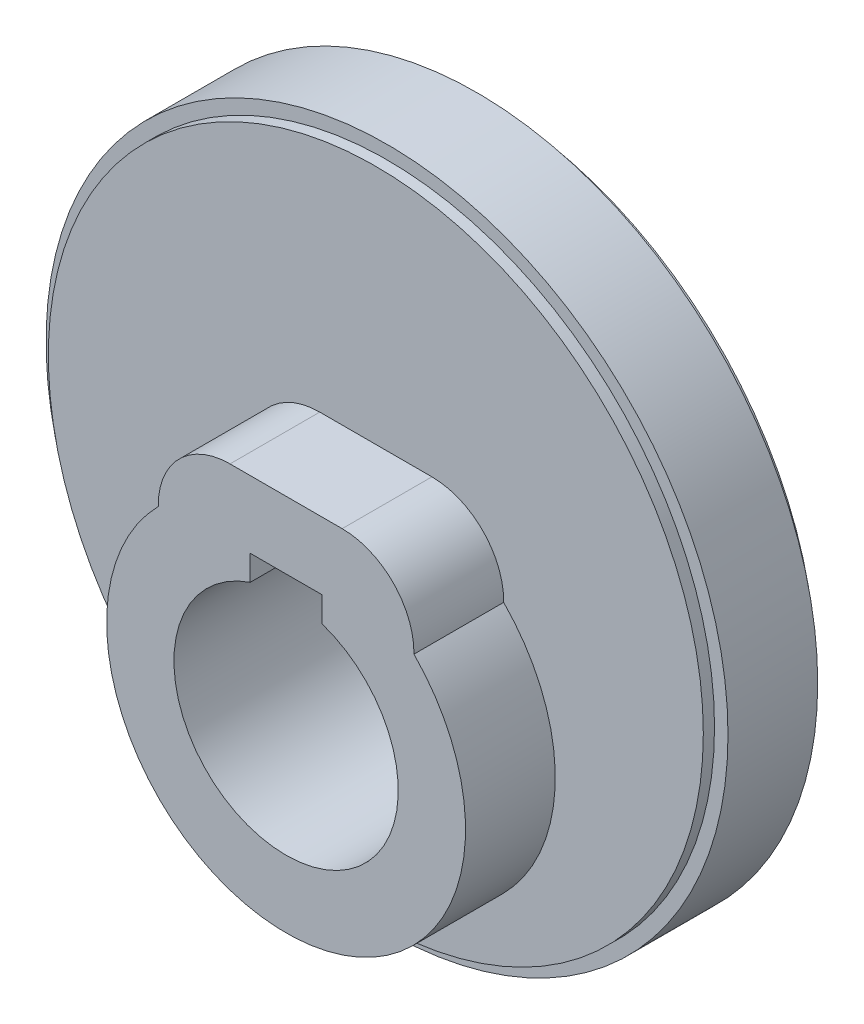
ISO-10303-21;
HEADER;
FILE_DESCRIPTION(('STEP AP214'),'2;1');
FILE_NAME('part.step','',(''),(''),'','','');
FILE_SCHEMA(('AUTOMOTIVE_DESIGN { 1 0 10303 214 1 1 1 1 }'));
ENDSEC;
DATA;
#1=APPLICATION_CONTEXT('core data for automotive mechanical design processes');
#2=APPLICATION_PROTOCOL_DEFINITION('international standard','automotive_design',2000,#1);
#3=PRODUCT_CONTEXT('',#1,'mechanical');
#4=PRODUCT('Part','Part','',(#3));
#5=PRODUCT_RELATED_PRODUCT_CATEGORY('part','',(#4));
#6=PRODUCT_DEFINITION_FORMATION('','',#4);
#7=PRODUCT_DEFINITION_CONTEXT('part definition',#1,'design');
#8=PRODUCT_DEFINITION('design','',#6,#7);
#9=PRODUCT_DEFINITION_SHAPE('','',#8);
#10=(LENGTH_UNIT() NAMED_UNIT(*) SI_UNIT(.MILLI.,.METRE.));
#11=(NAMED_UNIT(*) PLANE_ANGLE_UNIT() SI_UNIT($,.RADIAN.));
#12=(NAMED_UNIT(*) SI_UNIT($,.STERADIAN.) SOLID_ANGLE_UNIT());
#13=UNCERTAINTY_MEASURE_WITH_UNIT(LENGTH_MEASURE(1.E-05),#10,'distance_accuracy_value','');
#14=(GEOMETRIC_REPRESENTATION_CONTEXT(3) GLOBAL_UNCERTAINTY_ASSIGNED_CONTEXT((#13)) GLOBAL_UNIT_ASSIGNED_CONTEXT((#10,
#11,#12)) REPRESENTATION_CONTEXT('',''));
#15=CARTESIAN_POINT('',(0.,0.,0.));
#16=DIRECTION('',(0.,0.,1.));
#17=DIRECTION('',(1.,0.,0.));
#18=AXIS2_PLACEMENT_3D('',#15,#16,#17);
#19=CARTESIAN_POINT('',(0.,0.,25.));
#20=DIRECTION('',(0.,0.,-1.));
#21=DIRECTION('',(-1.,0.,0.));
#22=AXIS2_PLACEMENT_3D('',#19,#20,#21);
#23=CYLINDRICAL_SURFACE('',#22,73.);
#24=CARTESIAN_POINT('',(0.,0.,0.));
#25=DIRECTION('',(0.,0.,1.));
#26=DIRECTION('',(1.,0.,0.));
#27=AXIS2_PLACEMENT_3D('',#24,#25,#26);
#28=CIRCLE('',#27,73.);
#29=CARTESIAN_POINT('',(73.,0.,0.));
#30=VERTEX_POINT('',#29);
#31=EDGE_CURVE('E395',#30,#30,#28,.T.);
#32=ORIENTED_EDGE('',*,*,#31,.T.);
#33=EDGE_LOOP('',(#32));
#34=FACE_BOUND('',#33,.T.);
#35=CARTESIAN_POINT('',(0.,0.,2.5));
#36=DIRECTION('',(0.,0.,1.));
#37=DIRECTION('',(1.,0.,0.));
#38=AXIS2_PLACEMENT_3D('',#35,#36,#37);
#39=CIRCLE('',#38,73.);
#40=CARTESIAN_POINT('',(73.,0.,2.5));
#41=VERTEX_POINT('',#40);
#42=EDGE_CURVE('E11',#41,#41,#39,.T.);
#43=ORIENTED_EDGE('',*,*,#42,.F.);
#44=EDGE_LOOP('',(#43));
#45=FACE_BOUND('',#44,.T.);
#46=ADVANCED_FACE('F44',(#34,#45),#23,.T.);
#47=CARTESIAN_POINT('',(0.,0.,22.5));
#48=DIRECTION('',(0.,0.,1.));
#49=DIRECTION('',(1.,0.,0.));
#50=AXIS2_PLACEMENT_3D('',#47,#48,#49);
#51=CIRCLE('',#50,73.);
#52=CARTESIAN_POINT('',(73.,0.,22.5));
#53=VERTEX_POINT('',#52);
#54=EDGE_CURVE('E387',#53,#53,#51,.T.);
#55=ORIENTED_EDGE('',*,*,#54,.T.);
#56=EDGE_LOOP('',(#55));
#57=FACE_BOUND('',#56,.T.);
#58=CARTESIAN_POINT('',(0.,0.,25.));
#59=DIRECTION('',(0.,0.,1.));
#60=DIRECTION('',(1.,0.,0.));
#61=AXIS2_PLACEMENT_3D('',#58,#59,#60);
#62=CIRCLE('',#61,73.);
#63=CARTESIAN_POINT('',(73.,0.,25.));
#64=VERTEX_POINT('',#63);
#65=EDGE_CURVE('E399',#64,#64,#62,.T.);
#66=ORIENTED_EDGE('',*,*,#65,.F.);
#67=EDGE_LOOP('',(#66));
#68=FACE_BOUND('',#67,.T.);
#69=ADVANCED_FACE('F46',(#57,#68),#23,.T.);
#70=CARTESIAN_POINT('',(0.,0.,25.));
#71=DIRECTION('',(0.,0.,1.));
#72=DIRECTION('',(1.,0.,0.));
#73=AXIS2_PLACEMENT_3D('',#70,#71,#72);
#74=PLANE('',#73);
#75=ORIENTED_EDGE('',*,*,#65,.T.);
#76=EDGE_LOOP('',(#75));
#77=FACE_BOUND('',#76,.T.);
#78=CARTESIAN_POINT('',(0.,-25.,25.));
#79=DIRECTION('',(0.,0.,1.));
#80=DIRECTION('',(1.,0.,0.));
#81=AXIS2_PLACEMENT_3D('',#78,#79,#80);
#82=CIRCLE('',#81,40.);
#83=CARTESIAN_POINT('',(-28.4983263663444,3.06858376044858,25.));
#84=VERTEX_POINT('',#83);
#85=CARTESIAN_POINT('',(28.4983263663444,3.06858376044859,25.));
#86=VERTEX_POINT('',#85);
#87=EDGE_CURVE('E403',#84,#86,#82,.T.);
#88=ORIENTED_EDGE('',*,*,#87,.F.);
#89=CARTESIAN_POINT('',(-12.5,3.29999999999988,25.));
#90=DIRECTION('',(0.,0.,1.));
#91=DIRECTION('',(1.,0.,0.));
#92=AXIS2_PLACEMENT_3D('',#89,#90,#91);
#93=CIRCLE('',#92,16.);
#94=CARTESIAN_POINT('',(-12.5,19.2999999999999,25.));
#95=VERTEX_POINT('',#94);
#96=EDGE_CURVE('E406',#84,#95,#93,.F.);
#97=ORIENTED_EDGE('',*,*,#96,.T.);
#98=DIRECTION('',(1.,0.,0.));
#99=VECTOR('',#98,1.);
#100=CARTESIAN_POINT('',(0.,19.2999999999999,25.));
#101=LINE('',#100,#99);
#102=CARTESIAN_POINT('',(12.5,19.2999999999999,25.));
#103=VERTEX_POINT('',#102);
#104=EDGE_CURVE('E410',#95,#103,#101,.T.);
#105=ORIENTED_EDGE('',*,*,#104,.T.);
#106=CARTESIAN_POINT('',(12.5,3.29999999999988,25.));
#107=DIRECTION('',(0.,0.,1.));
#108=DIRECTION('',(1.,0.,0.));
#109=AXIS2_PLACEMENT_3D('',#106,#107,#108);
#110=CIRCLE('',#109,16.);
#111=EDGE_CURVE('E53',#86,#103,#110,.T.);
#112=ORIENTED_EDGE('',*,*,#111,.F.);
#113=EDGE_LOOP('',(#88,#97,#105,#112));
#114=FACE_BOUND('',#113,.T.);
#115=ADVANCED_FACE('F426',(#77,#114),#74,.T.);
#116=CARTESIAN_POINT('',(0.,0.,0.));
#117=DIRECTION('',(0.,0.,1.));
#118=DIRECTION('',(1.,0.,0.));
#119=AXIS2_PLACEMENT_3D('',#116,#117,#118);
#120=PLANE('',#119);
#121=CARTESIAN_POINT('',(15.5,30.8905179793496,0.));
#122=DIRECTION('',(0.,0.,1.));
#123=DIRECTION('',(1.,0.,0.));
#124=AXIS2_PLACEMENT_3D('',#121,#122,#123);
#125=CIRCLE('',#124,3.);
#126=CARTESIAN_POINT('',(14.698275862069,27.9996291183487,0.));
#127=VERTEX_POINT('',#126);
#128=CARTESIAN_POINT('',(12.5,30.8905179793496,0.));
#129=VERTEX_POINT('',#128);
#130=EDGE_CURVE('E207',#127,#129,#125,.F.);
#131=ORIENTED_EDGE('',*,*,#130,.F.);
#132=CARTESIAN_POINT('',(0.,-25.,0.));
#133=DIRECTION('',(0.,0.,1.));
#134=DIRECTION('',(1.,0.,0.));
#135=AXIS2_PLACEMENT_3D('',#132,#133,#134);
#136=CIRCLE('',#135,55.);
#137=CARTESIAN_POINT('',(49.3058767869639,-0.629310344827556,0.));
#138=VERTEX_POINT('',#137);
#139=EDGE_CURVE('E60',#138,#127,#136,.T.);
#140=ORIENTED_EDGE('',*,*,#139,.F.);
#141=CARTESIAN_POINT('',(51.9952882480711,0.700000000000033,0.));
#142=DIRECTION('',(0.,0.,1.));
#143=DIRECTION('',(1.,0.,0.));
#144=AXIS2_PLACEMENT_3D('',#141,#142,#143);
#145=CIRCLE('',#144,3.);
#146=CARTESIAN_POINT('',(54.995016416229,0.740384615384651,0.));
#147=VERTEX_POINT('',#146);
#148=EDGE_CURVE('E187',#138,#147,#145,.T.);
#149=ORIENTED_EDGE('',*,*,#148,.T.);
#150=CARTESIAN_POINT('',(0.,0.,0.));
#151=DIRECTION('',(0.,0.,1.));
#152=DIRECTION('',(1.,0.,0.));
#153=AXIS2_PLACEMENT_3D('',#150,#151,#152);
#154=CIRCLE('',#153,55.);
#155=CARTESIAN_POINT('',(16.3942307692308,52.4998018804377,0.));
#156=VERTEX_POINT('',#155);
#157=EDGE_CURVE('E230',#147,#156,#154,.T.);
#158=ORIENTED_EDGE('',*,*,#157,.T.);
#159=CARTESIAN_POINT('',(15.5,49.6361763233229,0.));
#160=DIRECTION('',(0.,0.,1.));
#161=DIRECTION('',(1.,0.,0.));
#162=AXIS2_PLACEMENT_3D('',#159,#160,#161);
#163=CIRCLE('',#162,3.00000000000001);
#164=CARTESIAN_POINT('',(12.5,49.6361763233229,0.));
#165=VERTEX_POINT('',#164);
#166=EDGE_CURVE('E234',#165,#156,#163,.F.);
#167=ORIENTED_EDGE('',*,*,#166,.F.);
#168=DIRECTION('',(0.,-1.,0.));
#169=VECTOR('',#168,1.);
#170=CARTESIAN_POINT('',(12.5,0.,0.));
#171=LINE('',#170,#169);
#172=EDGE_CURVE('E211',#165,#129,#171,.T.);
#173=ORIENTED_EDGE('',*,*,#172,.T.);
#174=EDGE_LOOP('',(#131,#140,#149,#158,#167,#173));
#175=FACE_BOUND('',#174,.T.);
#176=CARTESIAN_POINT('',(-15.5,30.8905179793496,0.));
#177=DIRECTION('',(0.,0.,1.));
#178=DIRECTION('',(1.,0.,0.));
#179=AXIS2_PLACEMENT_3D('',#176,#177,#178);
#180=CIRCLE('',#179,3.);
#181=CARTESIAN_POINT('',(-12.5,30.8905179793496,0.));
#182=VERTEX_POINT('',#181);
#183=CARTESIAN_POINT('',(-14.698275862069,27.9996291183487,0.));
#184=VERTEX_POINT('',#183);
#185=EDGE_CURVE('E259',#182,#184,#180,.F.);
#186=ORIENTED_EDGE('',*,*,#185,.F.);
#187=DIRECTION('',(0.,-1.,0.));
#188=VECTOR('',#187,1.);
#189=CARTESIAN_POINT('',(-12.5,0.,0.));
#190=LINE('',#189,#188);
#191=CARTESIAN_POINT('',(-12.5,49.6361763233229,0.));
#192=VERTEX_POINT('',#191);
#193=EDGE_CURVE('E68',#192,#182,#190,.T.);
#194=ORIENTED_EDGE('',*,*,#193,.F.);
#195=CARTESIAN_POINT('',(-15.5,49.6361763233229,0.));
#196=DIRECTION('',(0.,0.,1.));
#197=DIRECTION('',(1.,0.,0.));
#198=AXIS2_PLACEMENT_3D('',#195,#196,#197);
#199=CIRCLE('',#198,3.);
#200=CARTESIAN_POINT('',(-16.3942307692308,52.4998018804377,0.));
#201=VERTEX_POINT('',#200);
#202=EDGE_CURVE('E279',#192,#201,#199,.T.);
#203=ORIENTED_EDGE('',*,*,#202,.T.);
#204=CARTESIAN_POINT('',(0.,0.,0.));
#205=DIRECTION('',(0.,0.,1.));
#206=DIRECTION('',(1.,0.,0.));
#207=AXIS2_PLACEMENT_3D('',#204,#205,#206);
#208=CIRCLE('',#207,55.);
#209=CARTESIAN_POINT('',(-54.995016416229,0.740384615384616,0.));
#210=VERTEX_POINT('',#209);
#211=EDGE_CURVE('E283',#201,#210,#208,.T.);
#212=ORIENTED_EDGE('',*,*,#211,.T.);
#213=CARTESIAN_POINT('',(-51.9952882480711,0.7,0.));
#214=DIRECTION('',(0.,0.,1.));
#215=DIRECTION('',(1.,0.,0.));
#216=AXIS2_PLACEMENT_3D('',#213,#214,#215);
#217=CIRCLE('',#216,3.);
#218=CARTESIAN_POINT('',(-49.305876786964,-0.629310344827588,0.));
#219=VERTEX_POINT('',#218);
#220=EDGE_CURVE('E287',#210,#219,#217,.T.);
#221=ORIENTED_EDGE('',*,*,#220,.T.);
#222=CARTESIAN_POINT('',(0.,-25.,0.));
#223=DIRECTION('',(0.,0.,1.));
#224=DIRECTION('',(1.,0.,0.));
#225=AXIS2_PLACEMENT_3D('',#222,#223,#224);
#226=CIRCLE('',#225,55.);
#227=EDGE_CURVE('E291',#184,#219,#226,.T.);
#228=ORIENTED_EDGE('',*,*,#227,.F.);
#229=EDGE_LOOP('',(#186,#194,#203,#212,#221,#228));
#230=FACE_BOUND('',#229,.T.);
#231=ORIENTED_EDGE('',*,*,#31,.F.);
#232=EDGE_LOOP('',(#231));
#233=FACE_BOUND('',#232,.T.);
#234=CARTESIAN_POINT('',(0.,-25.,0.));
#235=DIRECTION('',(0.,0.,1.));
#236=DIRECTION('',(1.,0.,0.));
#237=AXIS2_PLACEMENT_3D('',#234,#235,#236);
#238=CIRCLE('',#237,25.);
#239=CARTESIAN_POINT('',(-8.,-1.31456143534598,0.));
#240=VERTEX_POINT('',#239);
#241=CARTESIAN_POINT('',(8.,-1.31456143534597,0.));
#242=VERTEX_POINT('',#241);
#243=EDGE_CURVE('E190',#240,#242,#238,.T.);
#244=ORIENTED_EDGE('',*,*,#243,.T.);
#245=DIRECTION('',(0.,-1.,0.));
#246=VECTOR('',#245,1.);
#247=CARTESIAN_POINT('',(8.,0.,0.));
#248=LINE('',#247,#246);
#249=CARTESIAN_POINT('',(8.,4.3,0.));
#250=VERTEX_POINT('',#249);
#251=EDGE_CURVE('E319',#250,#242,#248,.T.);
#252=ORIENTED_EDGE('',*,*,#251,.F.);
#253=DIRECTION('',(1.,0.,0.));
#254=VECTOR('',#253,1.);
#255=CARTESIAN_POINT('',(0.,4.3,0.));
#256=LINE('',#255,#254);
#257=CARTESIAN_POINT('',(-8.,4.3,0.));
#258=VERTEX_POINT('',#257);
#259=EDGE_CURVE('E352',#258,#250,#256,.T.);
#260=ORIENTED_EDGE('',*,*,#259,.F.);
#261=DIRECTION('',(0.,-1.,0.));
#262=VECTOR('',#261,1.);
#263=CARTESIAN_POINT('',(-8.,0.,0.));
#264=LINE('',#263,#262);
#265=EDGE_CURVE('E348',#258,#240,#264,.T.);
#266=ORIENTED_EDGE('',*,*,#265,.T.);
#267=EDGE_LOOP('',(#244,#252,#260,#266));
#268=FACE_BOUND('',#267,.T.);
#269=ADVANCED_FACE('F422',(#175,#230,#233,#268),#120,.F.);
#270=CARTESIAN_POINT('',(0.,0.,22.5));
#271=DIRECTION('',(0.,0.,-1.));
#272=DIRECTION('',(-1.,0.,0.));
#273=AXIS2_PLACEMENT_3D('',#270,#271,#272);
#274=CYLINDRICAL_SURFACE('',#273,76.);
#275=CARTESIAN_POINT('',(0.,0.,22.5));
#276=DIRECTION('',(0.,0.,1.));
#277=DIRECTION('',(1.,0.,0.));
#278=AXIS2_PLACEMENT_3D('',#275,#276,#277);
#279=CIRCLE('',#278,76.);
#280=CARTESIAN_POINT('',(76.,0.,22.5));
#281=VERTEX_POINT('',#280);
#282=EDGE_CURVE('E391',#281,#281,#279,.T.);
#283=ORIENTED_EDGE('',*,*,#282,.F.);
#284=EDGE_LOOP('',(#283));
#285=FACE_BOUND('',#284,.T.);
#286=CARTESIAN_POINT('',(0.,0.,2.5));
#287=DIRECTION('',(0.,0.,1.));
#288=DIRECTION('',(1.,0.,0.));
#289=AXIS2_PLACEMENT_3D('',#286,#287,#288);
#290=CIRCLE('',#289,76.);
#291=CARTESIAN_POINT('',(76.,0.,2.5));
#292=VERTEX_POINT('',#291);
#293=EDGE_CURVE('E373',#292,#292,#290,.T.);
#294=ORIENTED_EDGE('',*,*,#293,.T.);
#295=EDGE_LOOP('',(#294));
#296=FACE_BOUND('',#295,.T.);
#297=ADVANCED_FACE('F425',(#285,#296),#274,.T.);
#298=CARTESIAN_POINT('',(0.,0.,22.5));
#299=DIRECTION('',(0.,0.,1.));
#300=DIRECTION('',(1.,0.,0.));
#301=AXIS2_PLACEMENT_3D('',#298,#299,#300);
#302=PLANE('',#301);
#303=ORIENTED_EDGE('',*,*,#54,.F.);
#304=EDGE_LOOP('',(#303));
#305=FACE_BOUND('',#304,.T.);
#306=ORIENTED_EDGE('',*,*,#282,.T.);
#307=EDGE_LOOP('',(#306));
#308=FACE_BOUND('',#307,.T.);
#309=ADVANCED_FACE('F500',(#305,#308),#302,.T.);
#310=CARTESIAN_POINT('',(0.,0.,2.5));
#311=DIRECTION('',(0.,0.,1.));
#312=DIRECTION('',(1.,0.,0.));
#313=AXIS2_PLACEMENT_3D('',#310,#311,#312);
#314=PLANE('',#313);
#315=ORIENTED_EDGE('',*,*,#42,.T.);
#316=EDGE_LOOP('',(#315));
#317=FACE_BOUND('',#316,.T.);
#318=ORIENTED_EDGE('',*,*,#293,.F.);
#319=EDGE_LOOP('',(#318));
#320=FACE_BOUND('',#319,.T.);
#321=ADVANCED_FACE('F503',(#317,#320),#314,.F.);
#322=CARTESIAN_POINT('',(0.,-25.,45.));
#323=DIRECTION('',(0.,0.,-1.));
#324=DIRECTION('',(-1.,0.,0.));
#325=AXIS2_PLACEMENT_3D('',#322,#323,#324);
#326=CYLINDRICAL_SURFACE('',#325,25.);
#327=ORIENTED_EDGE('',*,*,#243,.F.);
#328=DIRECTION('',(0.,0.,-1.));
#329=VECTOR('',#328,1.);
#330=CARTESIAN_POINT('',(-8.,-1.31456143534598,45.));
#331=LINE('',#330,#329);
#332=CARTESIAN_POINT('',(-8.,-1.31456143534598,45.));
#333=VERTEX_POINT('',#332);
#334=EDGE_CURVE('E370',#333,#240,#331,.T.);
#335=ORIENTED_EDGE('',*,*,#334,.F.);
#336=CARTESIAN_POINT('',(0.,-25.,45.));
#337=DIRECTION('',(0.,0.,1.));
#338=DIRECTION('',(1.,0.,0.));
#339=AXIS2_PLACEMENT_3D('',#336,#337,#338);
#340=CIRCLE('',#339,25.);
#341=CARTESIAN_POINT('',(8.,-1.31456143534597,45.));
#342=VERTEX_POINT('',#341);
#343=EDGE_CURVE('E329',#333,#342,#340,.T.);
#344=ORIENTED_EDGE('',*,*,#343,.T.);
#345=DIRECTION('',(0.,0.,-1.));
#346=VECTOR('',#345,1.);
#347=CARTESIAN_POINT('',(8.,-1.31456143534597,45.));
#348=LINE('',#347,#346);
#349=EDGE_CURVE('E359',#342,#242,#348,.T.);
#350=ORIENTED_EDGE('',*,*,#349,.T.);
#351=EDGE_LOOP('',(#327,#335,#344,#350));
#352=FACE_BOUND('',#351,.T.);
#353=ADVANCED_FACE('F432',(#352),#326,.F.);
#354=CARTESIAN_POINT('',(-8.,0.,45.));
#355=DIRECTION('',(1.,0.,0.));
#356=DIRECTION('',(0.,0.,-1.));
#357=AXIS2_PLACEMENT_3D('',#354,#355,#356);
#358=PLANE('',#357);
#359=ORIENTED_EDGE('',*,*,#265,.F.);
#360=DIRECTION('',(0.,0.,-1.));
#361=VECTOR('',#360,1.);
#362=CARTESIAN_POINT('',(-8.,4.3,45.));
#363=LINE('',#362,#361);
#364=CARTESIAN_POINT('',(-8.,4.3,45.));
#365=VERTEX_POINT('',#364);
#366=EDGE_CURVE('E367',#365,#258,#363,.T.);
#367=ORIENTED_EDGE('',*,*,#366,.F.);
#368=DIRECTION('',(0.,-1.,0.));
#369=VECTOR('',#368,1.);
#370=CARTESIAN_POINT('',(-8.,0.,45.));
#371=LINE('',#370,#369);
#372=EDGE_CURVE('E333',#365,#333,#371,.T.);
#373=ORIENTED_EDGE('',*,*,#372,.T.);
#374=ORIENTED_EDGE('',*,*,#334,.T.);
#375=EDGE_LOOP('',(#359,#367,#373,#374));
#376=FACE_BOUND('',#375,.T.);
#377=ADVANCED_FACE('F442',(#376),#358,.T.);
#378=CARTESIAN_POINT('',(0.,4.3,45.));
#379=DIRECTION('',(0.,1.,0.));
#380=DIRECTION('',(-1.,0.,0.));
#381=AXIS2_PLACEMENT_3D('',#378,#379,#380);
#382=PLANE('',#381);
#383=ORIENTED_EDGE('',*,*,#259,.T.);
#384=DIRECTION('',(0.,0.,-1.));
#385=VECTOR('',#384,1.);
#386=CARTESIAN_POINT('',(8.,4.3,45.));
#387=LINE('',#386,#385);
#388=CARTESIAN_POINT('',(8.,4.3,45.));
#389=VERTEX_POINT('',#388);
#390=EDGE_CURVE('E362',#389,#250,#387,.T.);
#391=ORIENTED_EDGE('',*,*,#390,.F.);
#392=DIRECTION('',(1.,0.,0.));
#393=VECTOR('',#392,1.);
#394=CARTESIAN_POINT('',(0.,4.3,45.));
#395=LINE('',#394,#393);
#396=EDGE_CURVE('E337',#365,#389,#395,.T.);
#397=ORIENTED_EDGE('',*,*,#396,.F.);
#398=ORIENTED_EDGE('',*,*,#366,.T.);
#399=EDGE_LOOP('',(#383,#391,#397,#398));
#400=FACE_BOUND('',#399,.T.);
#401=ADVANCED_FACE('F440',(#400),#382,.F.);
#402=CARTESIAN_POINT('',(-12.5,3.29999999999988,45.));
#403=DIRECTION('',(0.,0.,-1.));
#404=DIRECTION('',(-1.,0.,0.));
#405=AXIS2_PLACEMENT_3D('',#402,#403,#404);
#406=CYLINDRICAL_SURFACE('',#405,16.);
#407=DIRECTION('',(0.,0.,-1.));
#408=VECTOR('',#407,1.);
#409=CARTESIAN_POINT('',(-12.5,19.2999999999999,45.));
#410=LINE('',#409,#408);
#411=CARTESIAN_POINT('',(-12.5,19.2999999999999,45.));
#412=VERTEX_POINT('',#411);
#413=EDGE_CURVE('E344',#412,#95,#410,.T.);
#414=ORIENTED_EDGE('',*,*,#413,.T.);
#415=ORIENTED_EDGE('',*,*,#96,.F.);
#416=DIRECTION('',(0.,0.,-1.));
#417=VECTOR('',#416,1.);
#418=CARTESIAN_POINT('',(-28.4983263663444,3.06858376044858,45.));
#419=LINE('',#418,#417);
#420=CARTESIAN_POINT('',(-28.4983263663444,3.06858376044858,45.));
#421=VERTEX_POINT('',#420);
#422=EDGE_CURVE('E363',#421,#84,#419,.T.);
#423=ORIENTED_EDGE('',*,*,#422,.F.);
#424=CARTESIAN_POINT('',(-12.5,3.29999999999988,45.));
#425=DIRECTION('',(0.,0.,1.));
#426=DIRECTION('',(1.,0.,0.));
#427=AXIS2_PLACEMENT_3D('',#424,#425,#426);
#428=CIRCLE('',#427,16.);
#429=EDGE_CURVE('E314',#421,#412,#428,.F.);
#430=ORIENTED_EDGE('',*,*,#429,.T.);
#431=EDGE_LOOP('',(#414,#415,#423,#430));
#432=FACE_BOUND('',#431,.T.);
#433=ADVANCED_FACE('F485',(#432),#406,.T.);
#434=CARTESIAN_POINT('',(0.,-25.,45.));
#435=DIRECTION('',(0.,0.,-1.));
#436=DIRECTION('',(-1.,0.,0.));
#437=AXIS2_PLACEMENT_3D('',#434,#435,#436);
#438=CYLINDRICAL_SURFACE('',#437,40.);
#439=ORIENTED_EDGE('',*,*,#87,.T.);
#440=DIRECTION('',(0.,0.,-1.));
#441=VECTOR('',#440,1.);
#442=CARTESIAN_POINT('',(28.4983263663444,3.06858376044859,45.));
#443=LINE('',#442,#441);
#444=CARTESIAN_POINT('',(28.4983263663444,3.06858376044859,45.));
#445=VERTEX_POINT('',#444);
#446=EDGE_CURVE('E380',#445,#86,#443,.T.);
#447=ORIENTED_EDGE('',*,*,#446,.F.);
#448=CARTESIAN_POINT('',(0.,-25.,45.));
#449=DIRECTION('',(0.,0.,1.));
#450=DIRECTION('',(1.,0.,0.));
#451=AXIS2_PLACEMENT_3D('',#448,#449,#450);
#452=CIRCLE('',#451,40.);
#453=EDGE_CURVE('E318',#421,#445,#452,.T.);
#454=ORIENTED_EDGE('',*,*,#453,.F.);
#455=ORIENTED_EDGE('',*,*,#422,.T.);
#456=EDGE_LOOP('',(#439,#447,#454,#455));
#457=FACE_BOUND('',#456,.T.);
#458=ADVANCED_FACE('F477',(#457),#438,.T.);
#459=CARTESIAN_POINT('',(12.5,3.29999999999988,45.));
#460=DIRECTION('',(0.,0.,-1.));
#461=DIRECTION('',(-1.,0.,0.));
#462=AXIS2_PLACEMENT_3D('',#459,#460,#461);
#463=CYLINDRICAL_SURFACE('',#462,16.);
#464=ORIENTED_EDGE('',*,*,#111,.T.);
#465=DIRECTION('',(0.,0.,-1.));
#466=VECTOR('',#465,1.);
#467=CARTESIAN_POINT('',(12.5,19.2999999999999,45.));
#468=LINE('',#467,#466);
#469=CARTESIAN_POINT('',(12.5,19.2999999999999,45.));
#470=VERTEX_POINT('',#469);
#471=EDGE_CURVE('E377',#470,#103,#468,.T.);
#472=ORIENTED_EDGE('',*,*,#471,.F.);
#473=CARTESIAN_POINT('',(12.5,3.29999999999988,45.));
#474=DIRECTION('',(0.,0.,1.));
#475=DIRECTION('',(1.,0.,0.));
#476=AXIS2_PLACEMENT_3D('',#473,#474,#475);
#477=CIRCLE('',#476,16.);
#478=EDGE_CURVE('E322',#445,#470,#477,.T.);
#479=ORIENTED_EDGE('',*,*,#478,.F.);
#480=ORIENTED_EDGE('',*,*,#446,.T.);
#481=EDGE_LOOP('',(#464,#472,#479,#480));
#482=FACE_BOUND('',#481,.T.);
#483=ADVANCED_FACE('F481',(#482),#463,.T.);
#484=CARTESIAN_POINT('',(0.,19.2999999999999,45.));
#485=DIRECTION('',(0.,1.,0.));
#486=DIRECTION('',(-1.,0.,0.));
#487=AXIS2_PLACEMENT_3D('',#484,#485,#486);
#488=PLANE('',#487);
#489=ORIENTED_EDGE('',*,*,#471,.T.);
#490=ORIENTED_EDGE('',*,*,#104,.F.);
#491=ORIENTED_EDGE('',*,*,#413,.F.);
#492=DIRECTION('',(1.,0.,0.));
#493=VECTOR('',#492,1.);
#494=CARTESIAN_POINT('',(0.,19.2999999999999,45.));
#495=LINE('',#494,#493);
#496=EDGE_CURVE('E325',#412,#470,#495,.T.);
#497=ORIENTED_EDGE('',*,*,#496,.T.);
#498=EDGE_LOOP('',(#489,#490,#491,#497));
#499=FACE_BOUND('',#498,.T.);
#500=ADVANCED_FACE('F456',(#499),#488,.T.);
#501=CARTESIAN_POINT('',(8.,0.,45.));
#502=DIRECTION('',(1.,0.,0.));
#503=DIRECTION('',(0.,0.,-1.));
#504=AXIS2_PLACEMENT_3D('',#501,#502,#503);
#505=PLANE('',#504);
#506=ORIENTED_EDGE('',*,*,#251,.T.);
#507=ORIENTED_EDGE('',*,*,#349,.F.);
#508=DIRECTION('',(0.,-1.,0.));
#509=VECTOR('',#508,1.);
#510=CARTESIAN_POINT('',(8.,0.,45.));
#511=LINE('',#510,#509);
#512=EDGE_CURVE('E341',#389,#342,#511,.T.);
#513=ORIENTED_EDGE('',*,*,#512,.F.);
#514=ORIENTED_EDGE('',*,*,#390,.T.);
#515=EDGE_LOOP('',(#506,#507,#513,#514));
#516=FACE_BOUND('',#515,.T.);
#517=ADVANCED_FACE('F436',(#516),#505,.F.);
#518=CARTESIAN_POINT('',(0.,0.,45.));
#519=DIRECTION('',(0.,0.,1.));
#520=DIRECTION('',(1.,0.,0.));
#521=AXIS2_PLACEMENT_3D('',#518,#519,#520);
#522=PLANE('',#521);
#523=ORIENTED_EDGE('',*,*,#429,.F.);
#524=ORIENTED_EDGE('',*,*,#453,.T.);
#525=ORIENTED_EDGE('',*,*,#478,.T.);
#526=ORIENTED_EDGE('',*,*,#496,.F.);
#527=EDGE_LOOP('',(#523,#524,#525,#526));
#528=FACE_BOUND('',#527,.T.);
#529=ORIENTED_EDGE('',*,*,#343,.F.);
#530=ORIENTED_EDGE('',*,*,#372,.F.);
#531=ORIENTED_EDGE('',*,*,#396,.T.);
#532=ORIENTED_EDGE('',*,*,#512,.T.);
#533=EDGE_LOOP('',(#529,#530,#531,#532));
#534=FACE_BOUND('',#533,.T.);
#535=ADVANCED_FACE('F445',(#528,#534),#522,.T.);
#536=CARTESIAN_POINT('',(-12.5,0.,10.));
#537=DIRECTION('',(1.,0.,0.));
#538=DIRECTION('',(0.,1.,0.));
#539=AXIS2_PLACEMENT_3D('',#536,#537,#538);
#540=PLANE('',#539);
#541=ORIENTED_EDGE('',*,*,#193,.T.);
#542=DIRECTION('',(0.,0.,-1.));
#543=VECTOR('',#542,1.);
#544=CARTESIAN_POINT('',(-12.5,30.8905179793496,10.));
#545=LINE('',#544,#543);
#546=CARTESIAN_POINT('',(-12.5,30.8905179793496,10.));
#547=VERTEX_POINT('',#546);
#548=EDGE_CURVE('E276',#547,#182,#545,.T.);
#549=ORIENTED_EDGE('',*,*,#548,.F.);
#550=DIRECTION('',(0.,-1.,0.));
#551=VECTOR('',#550,1.);
#552=CARTESIAN_POINT('',(-12.5,0.,10.));
#553=LINE('',#552,#551);
#554=CARTESIAN_POINT('',(-12.5,49.6361763233229,10.));
#555=VERTEX_POINT('',#554);
#556=EDGE_CURVE('E254',#555,#547,#553,.T.);
#557=ORIENTED_EDGE('',*,*,#556,.F.);
#558=DIRECTION('',(0.,0.,-1.));
#559=VECTOR('',#558,1.);
#560=CARTESIAN_POINT('',(-12.5,49.6361763233229,10.));
#561=LINE('',#560,#559);
#562=EDGE_CURVE('E227',#555,#192,#561,.T.);
#563=ORIENTED_EDGE('',*,*,#562,.T.);
#564=EDGE_LOOP('',(#541,#549,#557,#563));
#565=FACE_BOUND('',#564,.T.);
#566=ADVANCED_FACE('F447',(#565),#540,.F.);
#567=CARTESIAN_POINT('',(-15.5,49.6361763233229,10.));
#568=DIRECTION('',(0.,0.,-1.));
#569=DIRECTION('',(-1.,0.,0.));
#570=AXIS2_PLACEMENT_3D('',#567,#568,#569);
#571=CYLINDRICAL_SURFACE('',#570,3.);
#572=ORIENTED_EDGE('',*,*,#202,.F.);
#573=ORIENTED_EDGE('',*,*,#562,.F.);
#574=CARTESIAN_POINT('',(-15.5,49.6361763233229,10.));
#575=DIRECTION('',(0.,0.,1.));
#576=DIRECTION('',(1.,0.,0.));
#577=AXIS2_PLACEMENT_3D('',#574,#575,#576);
#578=CIRCLE('',#577,3.);
#579=CARTESIAN_POINT('',(-16.3942307692308,52.4998018804377,10.));
#580=VERTEX_POINT('',#579);
#581=EDGE_CURVE('E258',#555,#580,#578,.T.);
#582=ORIENTED_EDGE('',*,*,#581,.T.);
#583=DIRECTION('',(0.,0.,-1.));
#584=VECTOR('',#583,1.);
#585=CARTESIAN_POINT('',(-16.3942307692308,52.4998018804377,10.));
#586=LINE('',#585,#584);
#587=EDGE_CURVE('E309',#580,#201,#586,.T.);
#588=ORIENTED_EDGE('',*,*,#587,.T.);
#589=EDGE_LOOP('',(#572,#573,#582,#588));
#590=FACE_BOUND('',#589,.T.);
#591=ADVANCED_FACE('F454',(#590),#571,.F.);
#592=CARTESIAN_POINT('',(0.,0.,10.));
#593=DIRECTION('',(0.,0.,-1.));
#594=DIRECTION('',(-1.,0.,0.));
#595=AXIS2_PLACEMENT_3D('',#592,#593,#594);
#596=CYLINDRICAL_SURFACE('',#595,55.);
#597=ORIENTED_EDGE('',*,*,#211,.F.);
#598=ORIENTED_EDGE('',*,*,#587,.F.);
#599=CARTESIAN_POINT('',(0.,0.,10.));
#600=DIRECTION('',(0.,0.,1.));
#601=DIRECTION('',(1.,0.,0.));
#602=AXIS2_PLACEMENT_3D('',#599,#600,#601);
#603=CIRCLE('',#602,55.);
#604=CARTESIAN_POINT('',(-54.995016416229,0.740384615384616,10.));
#605=VERTEX_POINT('',#604);
#606=EDGE_CURVE('E262',#580,#605,#603,.T.);
#607=ORIENTED_EDGE('',*,*,#606,.T.);
#608=DIRECTION('',(0.,0.,-1.));
#609=VECTOR('',#608,1.);
#610=CARTESIAN_POINT('',(-54.995016416229,0.740384615384616,10.));
#611=LINE('',#610,#609);
#612=EDGE_CURVE('E306',#605,#210,#611,.T.);
#613=ORIENTED_EDGE('',*,*,#612,.T.);
#614=EDGE_LOOP('',(#597,#598,#607,#613));
#615=FACE_BOUND('',#614,.T.);
#616=ADVANCED_FACE('F595',(#615),#596,.F.);
#617=CARTESIAN_POINT('',(-51.9952882480711,0.7,10.));
#618=DIRECTION('',(0.,0.,-1.));
#619=DIRECTION('',(-1.,0.,0.));
#620=AXIS2_PLACEMENT_3D('',#617,#618,#619);
#621=CYLINDRICAL_SURFACE('',#620,3.);
#622=ORIENTED_EDGE('',*,*,#220,.F.);
#623=ORIENTED_EDGE('',*,*,#612,.F.);
#624=CARTESIAN_POINT('',(-51.9952882480711,0.7,10.));
#625=DIRECTION('',(0.,0.,1.));
#626=DIRECTION('',(1.,0.,0.));
#627=AXIS2_PLACEMENT_3D('',#624,#625,#626);
#628=CIRCLE('',#627,3.);
#629=CARTESIAN_POINT('',(-49.305876786964,-0.629310344827588,10.));
#630=VERTEX_POINT('',#629);
#631=EDGE_CURVE('E265',#605,#630,#628,.T.);
#632=ORIENTED_EDGE('',*,*,#631,.T.);
#633=DIRECTION('',(0.,0.,-1.));
#634=VECTOR('',#633,1.);
#635=CARTESIAN_POINT('',(-49.305876786964,-0.629310344827588,10.));
#636=LINE('',#635,#634);
#637=EDGE_CURVE('E303',#630,#219,#636,.T.);
#638=ORIENTED_EDGE('',*,*,#637,.T.);
#639=EDGE_LOOP('',(#622,#623,#632,#638));
#640=FACE_BOUND('',#639,.T.);
#641=ADVANCED_FACE('F606',(#640),#621,.F.);
#642=CARTESIAN_POINT('',(0.,-25.,10.));
#643=DIRECTION('',(0.,0.,-1.));
#644=DIRECTION('',(-1.,0.,0.));
#645=AXIS2_PLACEMENT_3D('',#642,#643,#644);
#646=CYLINDRICAL_SURFACE('',#645,55.);
#647=ORIENTED_EDGE('',*,*,#227,.T.);
#648=ORIENTED_EDGE('',*,*,#637,.F.);
#649=CARTESIAN_POINT('',(0.,-25.,10.));
#650=DIRECTION('',(0.,0.,1.));
#651=DIRECTION('',(1.,0.,0.));
#652=AXIS2_PLACEMENT_3D('',#649,#650,#651);
#653=CIRCLE('',#652,55.);
#654=CARTESIAN_POINT('',(-14.698275862069,27.9996291183487,10.));
#655=VERTEX_POINT('',#654);
#656=EDGE_CURVE('E268',#655,#630,#653,.T.);
#657=ORIENTED_EDGE('',*,*,#656,.F.);
#658=DIRECTION('',(0.,0.,-1.));
#659=VECTOR('',#658,1.);
#660=CARTESIAN_POINT('',(-14.698275862069,27.9996291183487,10.));
#661=LINE('',#660,#659);
#662=EDGE_CURVE('E300',#655,#184,#661,.T.);
#663=ORIENTED_EDGE('',*,*,#662,.T.);
#664=EDGE_LOOP('',(#647,#648,#657,#663));
#665=FACE_BOUND('',#664,.T.);
#666=ADVANCED_FACE('F617',(#665),#646,.T.);
#667=CARTESIAN_POINT('',(-15.5,30.8905179793496,10.));
#668=DIRECTION('',(0.,0.,-1.));
#669=DIRECTION('',(-1.,0.,0.));
#670=AXIS2_PLACEMENT_3D('',#667,#668,#669);
#671=CYLINDRICAL_SURFACE('',#670,3.);
#672=ORIENTED_EDGE('',*,*,#185,.T.);
#673=ORIENTED_EDGE('',*,*,#662,.F.);
#674=CARTESIAN_POINT('',(-15.5,30.8905179793496,10.));
#675=DIRECTION('',(0.,0.,1.));
#676=DIRECTION('',(1.,0.,0.));
#677=AXIS2_PLACEMENT_3D('',#674,#675,#676);
#678=CIRCLE('',#677,3.);
#679=EDGE_CURVE('E272',#547,#655,#678,.F.);
#680=ORIENTED_EDGE('',*,*,#679,.F.);
#681=ORIENTED_EDGE('',*,*,#548,.T.);
#682=EDGE_LOOP('',(#672,#673,#680,#681));
#683=FACE_BOUND('',#682,.T.);
#684=ADVANCED_FACE('F628',(#683),#671,.F.);
#685=CARTESIAN_POINT('',(0.,0.,10.));
#686=DIRECTION('',(0.,0.,1.));
#687=DIRECTION('',(1.,0.,0.));
#688=AXIS2_PLACEMENT_3D('',#685,#686,#687);
#689=PLANE('',#688);
#690=ORIENTED_EDGE('',*,*,#556,.T.);
#691=ORIENTED_EDGE('',*,*,#679,.T.);
#692=ORIENTED_EDGE('',*,*,#656,.T.);
#693=ORIENTED_EDGE('',*,*,#631,.F.);
#694=ORIENTED_EDGE('',*,*,#606,.F.);
#695=ORIENTED_EDGE('',*,*,#581,.F.);
#696=EDGE_LOOP('',(#690,#691,#692,#693,#694,#695));
#697=FACE_BOUND('',#696,.T.);
#698=ADVANCED_FACE('F639',(#697),#689,.F.);
#699=CARTESIAN_POINT('',(0.,-25.,10.));
#700=DIRECTION('',(0.,0.,-1.));
#701=DIRECTION('',(-1.,0.,0.));
#702=AXIS2_PLACEMENT_3D('',#699,#700,#701);
#703=CYLINDRICAL_SURFACE('',#702,55.);
#704=ORIENTED_EDGE('',*,*,#139,.T.);
#705=DIRECTION('',(0.,0.,-1.));
#706=VECTOR('',#705,1.);
#707=CARTESIAN_POINT('',(14.698275862069,27.9996291183488,10.));
#708=LINE('',#707,#706);
#709=CARTESIAN_POINT('',(14.698275862069,27.9996291183488,10.));
#710=VERTEX_POINT('',#709);
#711=EDGE_CURVE('E205',#710,#127,#708,.T.);
#712=ORIENTED_EDGE('',*,*,#711,.F.);
#713=CARTESIAN_POINT('',(0.,-25.,10.));
#714=DIRECTION('',(0.,0.,1.));
#715=DIRECTION('',(1.,0.,0.));
#716=AXIS2_PLACEMENT_3D('',#713,#714,#715);
#717=CIRCLE('',#716,55.);
#718=CARTESIAN_POINT('',(49.3058767869639,-0.629310344827556,10.));
#719=VERTEX_POINT('',#718);
#720=EDGE_CURVE('E198',#719,#710,#717,.T.);
#721=ORIENTED_EDGE('',*,*,#720,.F.);
#722=DIRECTION('',(0.,0.,-1.));
#723=VECTOR('',#722,1.);
#724=CARTESIAN_POINT('',(49.3058767869639,-0.629310344827556,10.));
#725=LINE('',#724,#723);
#726=EDGE_CURVE('E181',#719,#138,#725,.T.);
#727=ORIENTED_EDGE('',*,*,#726,.T.);
#728=EDGE_LOOP('',(#704,#712,#721,#727));
#729=FACE_BOUND('',#728,.T.);
#730=ADVANCED_FACE('F204',(#729),#703,.T.);
#731=CARTESIAN_POINT('',(51.9952882480711,0.700000000000033,10.));
#732=DIRECTION('',(0.,0.,-1.));
#733=DIRECTION('',(-1.,0.,0.));
#734=AXIS2_PLACEMENT_3D('',#731,#732,#733);
#735=CYLINDRICAL_SURFACE('',#734,3.);
#736=ORIENTED_EDGE('',*,*,#148,.F.);
#737=ORIENTED_EDGE('',*,*,#726,.F.);
#738=CARTESIAN_POINT('',(51.9952882480711,0.700000000000033,10.));
#739=DIRECTION('',(0.,0.,1.));
#740=DIRECTION('',(1.,0.,0.));
#741=AXIS2_PLACEMENT_3D('',#738,#739,#740);
#742=CIRCLE('',#741,3.);
#743=CARTESIAN_POINT('',(54.995016416229,0.740384615384651,10.));
#744=VERTEX_POINT('',#743);
#745=EDGE_CURVE('E184',#719,#744,#742,.T.);
#746=ORIENTED_EDGE('',*,*,#745,.T.);
#747=DIRECTION('',(0.,0.,-1.));
#748=VECTOR('',#747,1.);
#749=CARTESIAN_POINT('',(54.995016416229,0.740384615384651,10.));
#750=LINE('',#749,#748);
#751=EDGE_CURVE('E191',#744,#147,#750,.T.);
#752=ORIENTED_EDGE('',*,*,#751,.T.);
#753=EDGE_LOOP('',(#736,#737,#746,#752));
#754=FACE_BOUND('',#753,.T.);
#755=ADVANCED_FACE('F183',(#754),#735,.F.);
#756=CARTESIAN_POINT('',(0.,0.,10.));
#757=DIRECTION('',(0.,0.,-1.));
#758=DIRECTION('',(-1.,0.,0.));
#759=AXIS2_PLACEMENT_3D('',#756,#757,#758);
#760=CYLINDRICAL_SURFACE('',#759,55.);
#761=ORIENTED_EDGE('',*,*,#157,.F.);
#762=ORIENTED_EDGE('',*,*,#751,.F.);
#763=CARTESIAN_POINT('',(0.,0.,10.));
#764=DIRECTION('',(0.,0.,1.));
#765=DIRECTION('',(1.,0.,0.));
#766=AXIS2_PLACEMENT_3D('',#763,#764,#765);
#767=CIRCLE('',#766,55.);
#768=CARTESIAN_POINT('',(16.3942307692308,52.4998018804377,10.));
#769=VERTEX_POINT('',#768);
#770=EDGE_CURVE('E201',#744,#769,#767,.T.);
#771=ORIENTED_EDGE('',*,*,#770,.T.);
#772=DIRECTION('',(0.,0.,-1.));
#773=VECTOR('',#772,1.);
#774=CARTESIAN_POINT('',(16.3942307692308,52.4998018804377,10.));
#775=LINE('',#774,#773);
#776=EDGE_CURVE('E249',#769,#156,#775,.T.);
#777=ORIENTED_EDGE('',*,*,#776,.T.);
#778=EDGE_LOOP('',(#761,#762,#771,#777));
#779=FACE_BOUND('',#778,.T.);
#780=ADVANCED_FACE('F669',(#779),#760,.F.);
#781=CARTESIAN_POINT('',(15.5,49.6361763233229,10.));
#782=DIRECTION('',(0.,0.,-1.));
#783=DIRECTION('',(-1.,0.,0.));
#784=AXIS2_PLACEMENT_3D('',#781,#782,#783);
#785=CYLINDRICAL_SURFACE('',#784,3.00000000000001);
#786=ORIENTED_EDGE('',*,*,#166,.T.);
#787=ORIENTED_EDGE('',*,*,#776,.F.);
#788=CARTESIAN_POINT('',(15.5,49.6361763233229,10.));
#789=DIRECTION('',(0.,0.,1.));
#790=DIRECTION('',(1.,0.,0.));
#791=AXIS2_PLACEMENT_3D('',#788,#789,#790);
#792=CIRCLE('',#791,3.00000000000001);
#793=CARTESIAN_POINT('',(12.5,49.6361763233229,10.));
#794=VERTEX_POINT('',#793);
#795=EDGE_CURVE('E216',#794,#769,#792,.F.);
#796=ORIENTED_EDGE('',*,*,#795,.F.);
#797=DIRECTION('',(0.,0.,-1.));
#798=VECTOR('',#797,1.);
#799=CARTESIAN_POINT('',(12.5,49.6361763233229,10.));
#800=LINE('',#799,#798);
#801=EDGE_CURVE('E246',#794,#165,#800,.T.);
#802=ORIENTED_EDGE('',*,*,#801,.T.);
#803=EDGE_LOOP('',(#786,#787,#796,#802));
#804=FACE_BOUND('',#803,.T.);
#805=ADVANCED_FACE('F679',(#804),#785,.F.);
#806=CARTESIAN_POINT('',(12.5,0.,10.));
#807=DIRECTION('',(1.,0.,0.));
#808=DIRECTION('',(0.,1.,0.));
#809=AXIS2_PLACEMENT_3D('',#806,#807,#808);
#810=PLANE('',#809);
#811=ORIENTED_EDGE('',*,*,#172,.F.);
#812=ORIENTED_EDGE('',*,*,#801,.F.);
#813=DIRECTION('',(0.,-1.,0.));
#814=VECTOR('',#813,1.);
#815=CARTESIAN_POINT('',(12.5,0.,10.));
#816=LINE('',#815,#814);
#817=CARTESIAN_POINT('',(12.5,30.8905179793496,10.));
#818=VERTEX_POINT('',#817);
#819=EDGE_CURVE('E219',#794,#818,#816,.T.);
#820=ORIENTED_EDGE('',*,*,#819,.T.);
#821=DIRECTION('',(0.,0.,-1.));
#822=VECTOR('',#821,1.);
#823=CARTESIAN_POINT('',(12.5,30.8905179793496,10.));
#824=LINE('',#823,#822);
#825=EDGE_CURVE('E243',#818,#129,#824,.T.);
#826=ORIENTED_EDGE('',*,*,#825,.T.);
#827=EDGE_LOOP('',(#811,#812,#820,#826));
#828=FACE_BOUND('',#827,.T.);
#829=ADVANCED_FACE('F690',(#828),#810,.T.);
#830=CARTESIAN_POINT('',(15.5,30.8905179793496,10.));
#831=DIRECTION('',(0.,0.,-1.));
#832=DIRECTION('',(-1.,0.,0.));
#833=AXIS2_PLACEMENT_3D('',#830,#831,#832);
#834=CYLINDRICAL_SURFACE('',#833,3.);
#835=ORIENTED_EDGE('',*,*,#130,.T.);
#836=ORIENTED_EDGE('',*,*,#825,.F.);
#837=CARTESIAN_POINT('',(15.5,30.8905179793496,10.));
#838=DIRECTION('',(0.,0.,1.));
#839=DIRECTION('',(1.,0.,0.));
#840=AXIS2_PLACEMENT_3D('',#837,#838,#839);
#841=CIRCLE('',#840,3.);
#842=EDGE_CURVE('E222',#710,#818,#841,.F.);
#843=ORIENTED_EDGE('',*,*,#842,.F.);
#844=ORIENTED_EDGE('',*,*,#711,.T.);
#845=EDGE_LOOP('',(#835,#836,#843,#844));
#846=FACE_BOUND('',#845,.T.);
#847=ADVANCED_FACE('F701',(#846),#834,.F.);
#848=CARTESIAN_POINT('',(0.,0.,10.));
#849=DIRECTION('',(0.,0.,1.));
#850=DIRECTION('',(1.,0.,0.));
#851=AXIS2_PLACEMENT_3D('',#848,#849,#850);
#852=PLANE('',#851);
#853=ORIENTED_EDGE('',*,*,#720,.T.);
#854=ORIENTED_EDGE('',*,*,#842,.T.);
#855=ORIENTED_EDGE('',*,*,#819,.F.);
#856=ORIENTED_EDGE('',*,*,#795,.T.);
#857=ORIENTED_EDGE('',*,*,#770,.F.);
#858=ORIENTED_EDGE('',*,*,#745,.F.);
#859=EDGE_LOOP('',(#853,#854,#855,#856,#857,#858));
#860=FACE_BOUND('',#859,.T.);
#861=ADVANCED_FACE('F196',(#860),#852,.F.);
#862=CLOSED_SHELL('',(#46,#69,#115,#269,#297,#309,#321,#353,#377,#401,#433,#458,#483,#500,#517,
#535,#566,#591,#616,#641,#666,#684,#698,#730,#755,#780,#805,#829,#847,#861));
#863=MANIFOLD_SOLID_BREP('B2',#862);
#864=ADVANCED_BREP_SHAPE_REPRESENTATION('',(#18,#863),#14);
#865=SHAPE_DEFINITION_REPRESENTATION(#9,#864);
ENDSEC;
END-ISO-10303-21;
